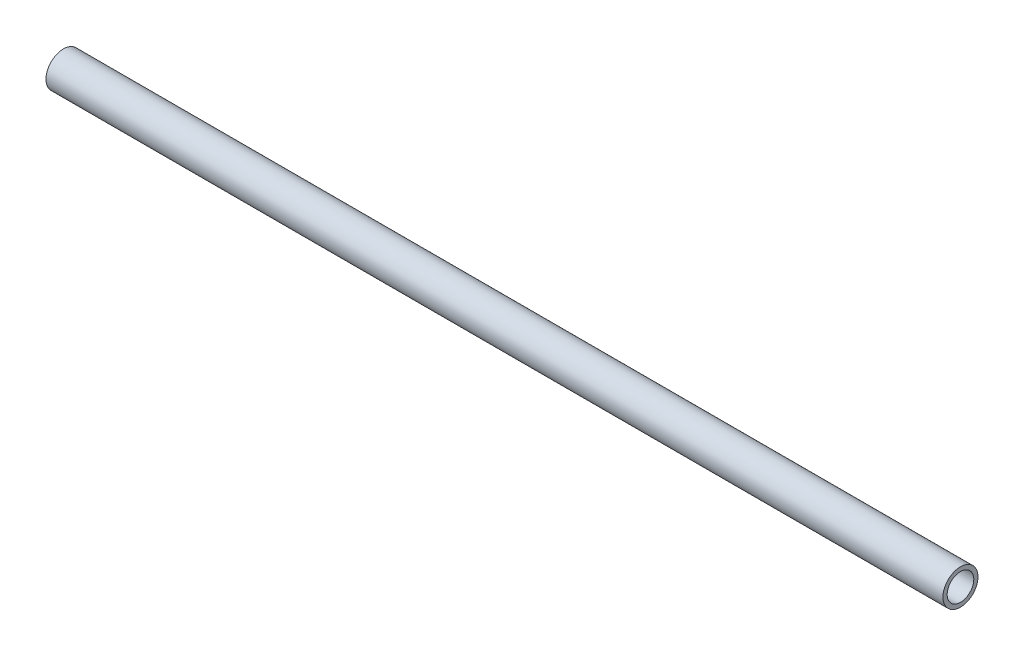
ISO-10303-21;
HEADER;
FILE_DESCRIPTION(('STEP AP214'),'2;1');
FILE_NAME('part.step','',(''),(''),'','','');
FILE_SCHEMA(('AUTOMOTIVE_DESIGN { 1 0 10303 214 1 1 1 1 }'));
ENDSEC;
DATA;
#1=APPLICATION_CONTEXT('core data for automotive mechanical design processes');
#2=APPLICATION_PROTOCOL_DEFINITION('international standard','automotive_design',2000,#1);
#3=PRODUCT_CONTEXT('',#1,'mechanical');
#4=PRODUCT('Part','Part','',(#3));
#5=PRODUCT_RELATED_PRODUCT_CATEGORY('part','',(#4));
#6=PRODUCT_DEFINITION_FORMATION('','',#4);
#7=PRODUCT_DEFINITION_CONTEXT('part definition',#1,'design');
#8=PRODUCT_DEFINITION('design','',#6,#7);
#9=PRODUCT_DEFINITION_SHAPE('','',#8);
#10=(LENGTH_UNIT() NAMED_UNIT(*) SI_UNIT(.MILLI.,.METRE.));
#11=(NAMED_UNIT(*) PLANE_ANGLE_UNIT() SI_UNIT($,.RADIAN.));
#12=(NAMED_UNIT(*) SI_UNIT($,.STERADIAN.) SOLID_ANGLE_UNIT());
#13=UNCERTAINTY_MEASURE_WITH_UNIT(LENGTH_MEASURE(1.E-05),#10,'distance_accuracy_value','');
#14=(GEOMETRIC_REPRESENTATION_CONTEXT(3) GLOBAL_UNCERTAINTY_ASSIGNED_CONTEXT((#13)) GLOBAL_UNIT_ASSIGNED_CONTEXT((#10,
#11,#12)) REPRESENTATION_CONTEXT('',''));
#15=CARTESIAN_POINT('',(0.,0.,0.));
#16=DIRECTION('',(0.,0.,1.));
#17=DIRECTION('',(1.,0.,0.));
#18=AXIS2_PLACEMENT_3D('',#15,#16,#17);
#19=CARTESIAN_POINT('',(650.,0.,0.));
#20=DIRECTION('',(1.,0.,0.));
#21=DIRECTION('',(0.,0.,-1.));
#22=AXIS2_PLACEMENT_3D('',#19,#20,#21);
#23=PLANE('',#22);
#24=CARTESIAN_POINT('',(650.,0.,0.));
#25=DIRECTION('',(1.,0.,0.));
#26=DIRECTION('',(0.,0.,-1.));
#27=AXIS2_PLACEMENT_3D('',#24,#25,#26);
#28=CIRCLE('',#27,12.7);
#29=CARTESIAN_POINT('',(650.,0.,-12.7));
#30=VERTEX_POINT('',#29);
#31=EDGE_CURVE('E10',#30,#30,#28,.T.);
#32=ORIENTED_EDGE('',*,*,#31,.T.);
#33=EDGE_LOOP('',(#32));
#34=FACE_BOUND('',#33,.T.);
#35=CARTESIAN_POINT('',(650.,0.,0.));
#36=DIRECTION('',(1.,0.,0.));
#37=DIRECTION('',(0.,0.,-1.));
#38=AXIS2_PLACEMENT_3D('',#35,#36,#37);
#39=CIRCLE('',#38,9.652);
#40=CARTESIAN_POINT('',(650.,0.,-9.652));
#41=VERTEX_POINT('',#40);
#42=EDGE_CURVE('E45',#41,#41,#39,.T.);
#43=ORIENTED_EDGE('',*,*,#42,.F.);
#44=EDGE_LOOP('',(#43));
#45=FACE_BOUND('',#44,.T.);
#46=ADVANCED_FACE('F34',(#34,#45),#23,.T.);
#47=CARTESIAN_POINT('',(0.,0.,0.));
#48=DIRECTION('',(1.,0.,0.));
#49=DIRECTION('',(0.,0.,-1.));
#50=AXIS2_PLACEMENT_3D('',#47,#48,#49);
#51=PLANE('',#50);
#52=CARTESIAN_POINT('',(0.,0.,0.));
#53=DIRECTION('',(1.,0.,0.));
#54=DIRECTION('',(0.,0.,-1.));
#55=AXIS2_PLACEMENT_3D('',#52,#53,#54);
#56=CIRCLE('',#55,12.7);
#57=CARTESIAN_POINT('',(0.,0.,-12.7));
#58=VERTEX_POINT('',#57);
#59=EDGE_CURVE('E38',#58,#58,#56,.T.);
#60=ORIENTED_EDGE('',*,*,#59,.F.);
#61=EDGE_LOOP('',(#60));
#62=FACE_BOUND('',#61,.T.);
#63=CARTESIAN_POINT('',(0.,0.,0.));
#64=DIRECTION('',(1.,0.,0.));
#65=DIRECTION('',(0.,0.,-1.));
#66=AXIS2_PLACEMENT_3D('',#63,#64,#65);
#67=CIRCLE('',#66,9.652);
#68=CARTESIAN_POINT('',(0.,0.,-9.652));
#69=VERTEX_POINT('',#68);
#70=EDGE_CURVE('E47',#69,#69,#67,.T.);
#71=ORIENTED_EDGE('',*,*,#70,.T.);
#72=EDGE_LOOP('',(#71));
#73=FACE_BOUND('',#72,.T.);
#74=ADVANCED_FACE('F57',(#62,#73),#51,.F.);
#75=CARTESIAN_POINT('',(650.,0.,0.));
#76=DIRECTION('',(-1.,0.,0.));
#77=DIRECTION('',(0.,0.,1.));
#78=AXIS2_PLACEMENT_3D('',#75,#76,#77);
#79=CYLINDRICAL_SURFACE('',#78,12.7);
#80=ORIENTED_EDGE('',*,*,#31,.F.);
#81=EDGE_LOOP('',(#80));
#82=FACE_BOUND('',#81,.T.);
#83=ORIENTED_EDGE('',*,*,#59,.T.);
#84=EDGE_LOOP('',(#83));
#85=FACE_BOUND('',#84,.T.);
#86=ADVANCED_FACE('F36',(#82,#85),#79,.T.);
#87=CARTESIAN_POINT('',(650.,0.,0.));
#88=DIRECTION('',(-1.,0.,0.));
#89=DIRECTION('',(0.,0.,1.));
#90=AXIS2_PLACEMENT_3D('',#87,#88,#89);
#91=CYLINDRICAL_SURFACE('',#90,9.652);
#92=ORIENTED_EDGE('',*,*,#42,.T.);
#93=EDGE_LOOP('',(#92));
#94=FACE_BOUND('',#93,.T.);
#95=ORIENTED_EDGE('',*,*,#70,.F.);
#96=EDGE_LOOP('',(#95));
#97=FACE_BOUND('',#96,.T.);
#98=ADVANCED_FACE('F53',(#94,#97),#91,.F.);
#99=CLOSED_SHELL('',(#46,#74,#86,#98));
#100=MANIFOLD_SOLID_BREP('B2',#99);
#101=ADVANCED_BREP_SHAPE_REPRESENTATION('',(#18,#100),#14);
#102=SHAPE_DEFINITION_REPRESENTATION(#9,#101);
ENDSEC;
END-ISO-10303-21;
